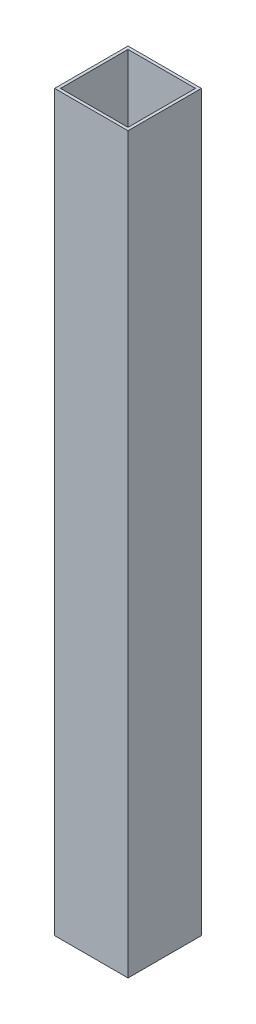
ISO-10303-21;
HEADER;
FILE_DESCRIPTION(('STEP AP214'),'2;1');
FILE_NAME('part.step','',(''),(''),'','','');
FILE_SCHEMA(('AUTOMOTIVE_DESIGN { 1 0 10303 214 1 1 1 1 }'));
ENDSEC;
DATA;
#1=APPLICATION_CONTEXT('core data for automotive mechanical design processes');
#2=APPLICATION_PROTOCOL_DEFINITION('international standard','automotive_design',2000,#1);
#3=PRODUCT_CONTEXT('',#1,'mechanical');
#4=PRODUCT('Part','Part','',(#3));
#5=PRODUCT_RELATED_PRODUCT_CATEGORY('part','',(#4));
#6=PRODUCT_DEFINITION_FORMATION('','',#4);
#7=PRODUCT_DEFINITION_CONTEXT('part definition',#1,'design');
#8=PRODUCT_DEFINITION('design','',#6,#7);
#9=PRODUCT_DEFINITION_SHAPE('','',#8);
#10=(LENGTH_UNIT() NAMED_UNIT(*) SI_UNIT(.MILLI.,.METRE.));
#11=(NAMED_UNIT(*) PLANE_ANGLE_UNIT() SI_UNIT($,.RADIAN.));
#12=(NAMED_UNIT(*) SI_UNIT($,.STERADIAN.) SOLID_ANGLE_UNIT());
#13=UNCERTAINTY_MEASURE_WITH_UNIT(LENGTH_MEASURE(1.E-05),#10,'distance_accuracy_value','');
#14=(GEOMETRIC_REPRESENTATION_CONTEXT(3) GLOBAL_UNCERTAINTY_ASSIGNED_CONTEXT((#13)) GLOBAL_UNIT_ASSIGNED_CONTEXT((#10,
#11,#12)) REPRESENTATION_CONTEXT('',''));
#15=CARTESIAN_POINT('',(0.,0.,0.));
#16=DIRECTION('',(0.,0.,1.));
#17=DIRECTION('',(1.,0.,0.));
#18=AXIS2_PLACEMENT_3D('',#15,#16,#17);
#19=CARTESIAN_POINT('',(0.,500.,0.));
#20=DIRECTION('',(0.,-1.,0.));
#21=DIRECTION('',(0.,0.,-1.));
#22=AXIS2_PLACEMENT_3D('',#19,#20,#21);
#23=PLANE('',#22);
#24=DIRECTION('',(0.,0.,-1.));
#25=VECTOR('',#24,1.);
#26=CARTESIAN_POINT('',(25.,500.,25.));
#27=LINE('',#26,#25);
#28=CARTESIAN_POINT('',(25.,500.,25.));
#29=VERTEX_POINT('',#28);
#30=CARTESIAN_POINT('',(25.,500.,-25.));
#31=VERTEX_POINT('',#30);
#32=EDGE_CURVE('E153',#29,#31,#27,.T.);
#33=ORIENTED_EDGE('',*,*,#32,.T.);
#34=DIRECTION('',(-1.,0.,0.));
#35=VECTOR('',#34,1.);
#36=CARTESIAN_POINT('',(-25.,500.,-25.));
#37=LINE('',#36,#35);
#38=CARTESIAN_POINT('',(-25.,500.,-25.));
#39=VERTEX_POINT('',#38);
#40=EDGE_CURVE('E157',#31,#39,#37,.T.);
#41=ORIENTED_EDGE('',*,*,#40,.T.);
#42=DIRECTION('',(0.,0.,1.));
#43=VECTOR('',#42,1.);
#44=CARTESIAN_POINT('',(-25.,500.,25.));
#45=LINE('',#44,#43);
#46=CARTESIAN_POINT('',(-25.,500.,25.));
#47=VERTEX_POINT('',#46);
#48=EDGE_CURVE('E161',#39,#47,#45,.T.);
#49=ORIENTED_EDGE('',*,*,#48,.T.);
#50=DIRECTION('',(1.,0.,0.));
#51=VECTOR('',#50,1.);
#52=CARTESIAN_POINT('',(-25.,500.,25.));
#53=LINE('',#52,#51);
#54=EDGE_CURVE('E164',#47,#29,#53,.T.);
#55=ORIENTED_EDGE('',*,*,#54,.T.);
#56=EDGE_LOOP('',(#33,#41,#49,#55));
#57=FACE_BOUND('',#56,.T.);
#58=DIRECTION('',(0.,0.,1.));
#59=VECTOR('',#58,1.);
#60=CARTESIAN_POINT('',(-23.,500.,23.));
#61=LINE('',#60,#59);
#62=CARTESIAN_POINT('',(-23.,500.,-23.));
#63=VERTEX_POINT('',#62);
#64=CARTESIAN_POINT('',(-23.,500.,23.));
#65=VERTEX_POINT('',#64);
#66=EDGE_CURVE('E105',#63,#65,#61,.T.);
#67=ORIENTED_EDGE('',*,*,#66,.F.);
#68=DIRECTION('',(-1.,0.,0.));
#69=VECTOR('',#68,1.);
#70=CARTESIAN_POINT('',(-23.,500.,-23.));
#71=LINE('',#70,#69);
#72=CARTESIAN_POINT('',(23.,500.,-23.));
#73=VERTEX_POINT('',#72);
#74=EDGE_CURVE('E131',#73,#63,#71,.T.);
#75=ORIENTED_EDGE('',*,*,#74,.F.);
#76=DIRECTION('',(0.,0.,-1.));
#77=VECTOR('',#76,1.);
#78=CARTESIAN_POINT('',(23.,500.,23.));
#79=LINE('',#78,#77);
#80=CARTESIAN_POINT('',(23.,500.,23.));
#81=VERTEX_POINT('',#80);
#82=EDGE_CURVE('E127',#81,#73,#79,.T.);
#83=ORIENTED_EDGE('',*,*,#82,.F.);
#84=DIRECTION('',(1.,0.,0.));
#85=VECTOR('',#84,1.);
#86=CARTESIAN_POINT('',(-23.,500.,23.));
#87=LINE('',#86,#85);
#88=EDGE_CURVE('E114',#65,#81,#87,.T.);
#89=ORIENTED_EDGE('',*,*,#88,.F.);
#90=EDGE_LOOP('',(#67,#75,#83,#89));
#91=FACE_BOUND('',#90,.T.);
#92=ADVANCED_FACE('F39',(#57,#91),#23,.F.);
#93=CARTESIAN_POINT('',(0.,0.,0.));
#94=DIRECTION('',(0.,-1.,0.));
#95=DIRECTION('',(0.,0.,-1.));
#96=AXIS2_PLACEMENT_3D('',#93,#94,#95);
#97=PLANE('',#96);
#98=DIRECTION('',(0.,0.,-1.));
#99=VECTOR('',#98,1.);
#100=CARTESIAN_POINT('',(25.,0.,25.));
#101=LINE('',#100,#99);
#102=CARTESIAN_POINT('',(25.,0.,25.));
#103=VERTEX_POINT('',#102);
#104=CARTESIAN_POINT('',(25.,0.,-25.));
#105=VERTEX_POINT('',#104);
#106=EDGE_CURVE('E123',#103,#105,#101,.T.);
#107=ORIENTED_EDGE('',*,*,#106,.F.);
#108=DIRECTION('',(1.,0.,0.));
#109=VECTOR('',#108,1.);
#110=CARTESIAN_POINT('',(-25.,0.,25.));
#111=LINE('',#110,#109);
#112=CARTESIAN_POINT('',(-25.,0.,25.));
#113=VERTEX_POINT('',#112);
#114=EDGE_CURVE('E158',#113,#103,#111,.T.);
#115=ORIENTED_EDGE('',*,*,#114,.F.);
#116=DIRECTION('',(0.,0.,1.));
#117=VECTOR('',#116,1.);
#118=CARTESIAN_POINT('',(-25.,0.,25.));
#119=LINE('',#118,#117);
#120=CARTESIAN_POINT('',(-25.,0.,-25.));
#121=VERTEX_POINT('',#120);
#122=EDGE_CURVE('E174',#121,#113,#119,.T.);
#123=ORIENTED_EDGE('',*,*,#122,.F.);
#124=DIRECTION('',(-1.,0.,0.));
#125=VECTOR('',#124,1.);
#126=CARTESIAN_POINT('',(-25.,0.,-25.));
#127=LINE('',#126,#125);
#128=EDGE_CURVE('E171',#105,#121,#127,.T.);
#129=ORIENTED_EDGE('',*,*,#128,.F.);
#130=EDGE_LOOP('',(#107,#115,#123,#129));
#131=FACE_BOUND('',#130,.T.);
#132=DIRECTION('',(-1.,0.,0.));
#133=VECTOR('',#132,1.);
#134=CARTESIAN_POINT('',(-23.,0.,-23.));
#135=LINE('',#134,#133);
#136=CARTESIAN_POINT('',(23.,0.,-23.));
#137=VERTEX_POINT('',#136);
#138=CARTESIAN_POINT('',(-23.,0.,-23.));
#139=VERTEX_POINT('',#138);
#140=EDGE_CURVE('E115',#137,#139,#135,.T.);
#141=ORIENTED_EDGE('',*,*,#140,.T.);
#142=DIRECTION('',(0.,0.,1.));
#143=VECTOR('',#142,1.);
#144=CARTESIAN_POINT('',(-23.,0.,23.));
#145=LINE('',#144,#143);
#146=CARTESIAN_POINT('',(-23.,0.,23.));
#147=VERTEX_POINT('',#146);
#148=EDGE_CURVE('E63',#139,#147,#145,.T.);
#149=ORIENTED_EDGE('',*,*,#148,.T.);
#150=DIRECTION('',(1.,0.,0.));
#151=VECTOR('',#150,1.);
#152=CARTESIAN_POINT('',(-23.,0.,23.));
#153=LINE('',#152,#151);
#154=CARTESIAN_POINT('',(23.,0.,23.));
#155=VERTEX_POINT('',#154);
#156=EDGE_CURVE('E121',#147,#155,#153,.T.);
#157=ORIENTED_EDGE('',*,*,#156,.T.);
#158=DIRECTION('',(0.,0.,-1.));
#159=VECTOR('',#158,1.);
#160=CARTESIAN_POINT('',(23.,0.,23.));
#161=LINE('',#160,#159);
#162=EDGE_CURVE('E140',#155,#137,#161,.T.);
#163=ORIENTED_EDGE('',*,*,#162,.T.);
#164=EDGE_LOOP('',(#141,#149,#157,#163));
#165=FACE_BOUND('',#164,.T.);
#166=ADVANCED_FACE('F197',(#131,#165),#97,.T.);
#167=CARTESIAN_POINT('',(25.,500.,25.));
#168=DIRECTION('',(-1.,0.,0.));
#169=DIRECTION('',(0.,0.,1.));
#170=AXIS2_PLACEMENT_3D('',#167,#168,#169);
#171=PLANE('',#170);
#172=ORIENTED_EDGE('',*,*,#106,.T.);
#173=DIRECTION('',(0.,-1.,0.));
#174=VECTOR('',#173,1.);
#175=CARTESIAN_POINT('',(25.,500.,-25.));
#176=LINE('',#175,#174);
#177=EDGE_CURVE('E11',#31,#105,#176,.T.);
#178=ORIENTED_EDGE('',*,*,#177,.F.);
#179=ORIENTED_EDGE('',*,*,#32,.F.);
#180=DIRECTION('',(0.,-1.,0.));
#181=VECTOR('',#180,1.);
#182=CARTESIAN_POINT('',(25.,500.,25.));
#183=LINE('',#182,#181);
#184=EDGE_CURVE('E167',#29,#103,#183,.T.);
#185=ORIENTED_EDGE('',*,*,#184,.T.);
#186=EDGE_LOOP('',(#172,#178,#179,#185));
#187=FACE_BOUND('',#186,.T.);
#188=ADVANCED_FACE('F41',(#187),#171,.F.);
#189=CARTESIAN_POINT('',(-25.,500.,-25.));
#190=DIRECTION('',(0.,0.,1.));
#191=DIRECTION('',(1.,0.,0.));
#192=AXIS2_PLACEMENT_3D('',#189,#190,#191);
#193=PLANE('',#192);
#194=ORIENTED_EDGE('',*,*,#128,.T.);
#195=DIRECTION('',(0.,-1.,0.));
#196=VECTOR('',#195,1.);
#197=CARTESIAN_POINT('',(-25.,500.,-25.));
#198=LINE('',#197,#196);
#199=EDGE_CURVE('E48',#39,#121,#198,.T.);
#200=ORIENTED_EDGE('',*,*,#199,.F.);
#201=ORIENTED_EDGE('',*,*,#40,.F.);
#202=ORIENTED_EDGE('',*,*,#177,.T.);
#203=EDGE_LOOP('',(#194,#200,#201,#202));
#204=FACE_BOUND('',#203,.T.);
#205=ADVANCED_FACE('F207',(#204),#193,.F.);
#206=CARTESIAN_POINT('',(-25.,500.,25.));
#207=DIRECTION('',(1.,0.,0.));
#208=DIRECTION('',(0.,0.,-1.));
#209=AXIS2_PLACEMENT_3D('',#206,#207,#208);
#210=PLANE('',#209);
#211=ORIENTED_EDGE('',*,*,#122,.T.);
#212=DIRECTION('',(0.,-1.,0.));
#213=VECTOR('',#212,1.);
#214=CARTESIAN_POINT('',(-25.,500.,25.));
#215=LINE('',#214,#213);
#216=EDGE_CURVE('E182',#47,#113,#215,.T.);
#217=ORIENTED_EDGE('',*,*,#216,.F.);
#218=ORIENTED_EDGE('',*,*,#48,.F.);
#219=ORIENTED_EDGE('',*,*,#199,.T.);
#220=EDGE_LOOP('',(#211,#217,#218,#219));
#221=FACE_BOUND('',#220,.T.);
#222=ADVANCED_FACE('F191',(#221),#210,.F.);
#223=CARTESIAN_POINT('',(-25.,500.,25.));
#224=DIRECTION('',(0.,0.,-1.));
#225=DIRECTION('',(-1.,0.,0.));
#226=AXIS2_PLACEMENT_3D('',#223,#224,#225);
#227=PLANE('',#226);
#228=ORIENTED_EDGE('',*,*,#114,.T.);
#229=ORIENTED_EDGE('',*,*,#184,.F.);
#230=ORIENTED_EDGE('',*,*,#54,.F.);
#231=ORIENTED_EDGE('',*,*,#216,.T.);
#232=EDGE_LOOP('',(#228,#229,#230,#231));
#233=FACE_BOUND('',#232,.T.);
#234=ADVANCED_FACE('F201',(#233),#227,.F.);
#235=CARTESIAN_POINT('',(-23.,500.,23.));
#236=DIRECTION('',(1.,0.,0.));
#237=DIRECTION('',(0.,0.,-1.));
#238=AXIS2_PLACEMENT_3D('',#235,#236,#237);
#239=PLANE('',#238);
#240=ORIENTED_EDGE('',*,*,#148,.F.);
#241=DIRECTION('',(0.,-1.,0.));
#242=VECTOR('',#241,1.);
#243=CARTESIAN_POINT('',(-23.,500.,-23.));
#244=LINE('',#243,#242);
#245=EDGE_CURVE('E109',#63,#139,#244,.T.);
#246=ORIENTED_EDGE('',*,*,#245,.F.);
#247=ORIENTED_EDGE('',*,*,#66,.T.);
#248=DIRECTION('',(0.,-1.,0.));
#249=VECTOR('',#248,1.);
#250=CARTESIAN_POINT('',(-23.,500.,23.));
#251=LINE('',#250,#249);
#252=EDGE_CURVE('E108',#65,#147,#251,.T.);
#253=ORIENTED_EDGE('',*,*,#252,.T.);
#254=EDGE_LOOP('',(#240,#246,#247,#253));
#255=FACE_BOUND('',#254,.T.);
#256=ADVANCED_FACE('F107',(#255),#239,.T.);
#257=CARTESIAN_POINT('',(-23.,500.,23.));
#258=DIRECTION('',(0.,0.,-1.));
#259=DIRECTION('',(-1.,0.,0.));
#260=AXIS2_PLACEMENT_3D('',#257,#258,#259);
#261=PLANE('',#260);
#262=ORIENTED_EDGE('',*,*,#156,.F.);
#263=ORIENTED_EDGE('',*,*,#252,.F.);
#264=ORIENTED_EDGE('',*,*,#88,.T.);
#265=DIRECTION('',(0.,-1.,0.));
#266=VECTOR('',#265,1.);
#267=CARTESIAN_POINT('',(23.,500.,23.));
#268=LINE('',#267,#266);
#269=EDGE_CURVE('E124',#81,#155,#268,.T.);
#270=ORIENTED_EDGE('',*,*,#269,.T.);
#271=EDGE_LOOP('',(#262,#263,#264,#270));
#272=FACE_BOUND('',#271,.T.);
#273=ADVANCED_FACE('F118',(#272),#261,.T.);
#274=CARTESIAN_POINT('',(23.,500.,23.));
#275=DIRECTION('',(-1.,0.,0.));
#276=DIRECTION('',(0.,0.,1.));
#277=AXIS2_PLACEMENT_3D('',#274,#275,#276);
#278=PLANE('',#277);
#279=ORIENTED_EDGE('',*,*,#162,.F.);
#280=ORIENTED_EDGE('',*,*,#269,.F.);
#281=ORIENTED_EDGE('',*,*,#82,.T.);
#282=DIRECTION('',(0.,-1.,0.));
#283=VECTOR('',#282,1.);
#284=CARTESIAN_POINT('',(23.,500.,-23.));
#285=LINE('',#284,#283);
#286=EDGE_CURVE('E55',#73,#137,#285,.T.);
#287=ORIENTED_EDGE('',*,*,#286,.T.);
#288=EDGE_LOOP('',(#279,#280,#281,#287));
#289=FACE_BOUND('',#288,.T.);
#290=ADVANCED_FACE('F230',(#289),#278,.T.);
#291=CARTESIAN_POINT('',(-23.,500.,-23.));
#292=DIRECTION('',(0.,0.,1.));
#293=DIRECTION('',(1.,0.,0.));
#294=AXIS2_PLACEMENT_3D('',#291,#292,#293);
#295=PLANE('',#294);
#296=ORIENTED_EDGE('',*,*,#140,.F.);
#297=ORIENTED_EDGE('',*,*,#286,.F.);
#298=ORIENTED_EDGE('',*,*,#74,.T.);
#299=ORIENTED_EDGE('',*,*,#245,.T.);
#300=EDGE_LOOP('',(#296,#297,#298,#299));
#301=FACE_BOUND('',#300,.T.);
#302=ADVANCED_FACE('F234',(#301),#295,.T.);
#303=CLOSED_SHELL('',(#92,#166,#188,#205,#222,#234,#256,#273,#290,#302));
#304=MANIFOLD_SOLID_BREP('B2',#303);
#305=ADVANCED_BREP_SHAPE_REPRESENTATION('',(#18,#304),#14);
#306=SHAPE_DEFINITION_REPRESENTATION(#9,#305);
ENDSEC;
END-ISO-10303-21;
